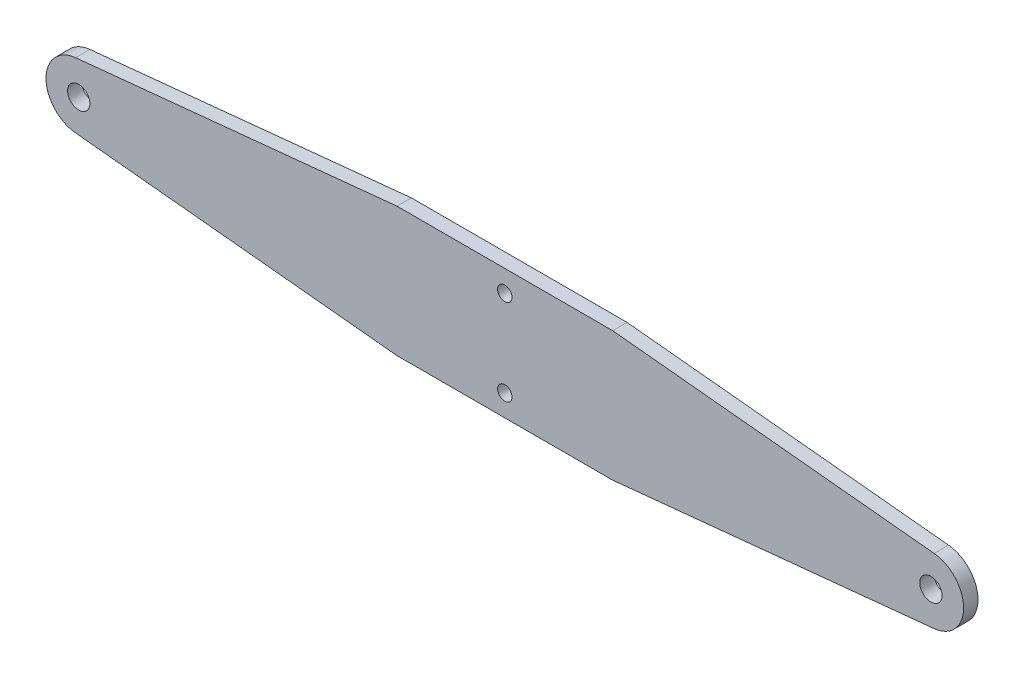
ISO-10303-21;
HEADER;
FILE_DESCRIPTION(('STEP AP214'),'2;1');
FILE_NAME('part.step','',(''),(''),'','','');
FILE_SCHEMA(('AUTOMOTIVE_DESIGN { 1 0 10303 214 1 1 1 1 }'));
ENDSEC;
DATA;
#1=APPLICATION_CONTEXT('core data for automotive mechanical design processes');
#2=APPLICATION_PROTOCOL_DEFINITION('international standard','automotive_design',2000,#1);
#3=PRODUCT_CONTEXT('',#1,'mechanical');
#4=PRODUCT('Part','Part','',(#3));
#5=PRODUCT_RELATED_PRODUCT_CATEGORY('part','',(#4));
#6=PRODUCT_DEFINITION_FORMATION('','',#4);
#7=PRODUCT_DEFINITION_CONTEXT('part definition',#1,'design');
#8=PRODUCT_DEFINITION('design','',#6,#7);
#9=PRODUCT_DEFINITION_SHAPE('','',#8);
#10=(LENGTH_UNIT() NAMED_UNIT(*) SI_UNIT(.MILLI.,.METRE.));
#11=(NAMED_UNIT(*) PLANE_ANGLE_UNIT() SI_UNIT($,.RADIAN.));
#12=(NAMED_UNIT(*) SI_UNIT($,.STERADIAN.) SOLID_ANGLE_UNIT());
#13=UNCERTAINTY_MEASURE_WITH_UNIT(LENGTH_MEASURE(1.E-05),#10,'distance_accuracy_value','');
#14=(GEOMETRIC_REPRESENTATION_CONTEXT(3) GLOBAL_UNCERTAINTY_ASSIGNED_CONTEXT((#13)) GLOBAL_UNIT_ASSIGNED_CONTEXT((#10,
#11,#12)) REPRESENTATION_CONTEXT('',''));
#15=CARTESIAN_POINT('',(0.,0.,0.));
#16=DIRECTION('',(0.,0.,1.));
#17=DIRECTION('',(1.,0.,0.));
#18=AXIS2_PLACEMENT_3D('',#15,#16,#17);
#19=CARTESIAN_POINT('',(-59.25,-3.57680115802996E-13,-2.));
#20=DIRECTION('',(0.,0.,-1.));
#21=DIRECTION('',(1.,0.,0.));
#22=AXIS2_PLACEMENT_3D('',#19,#20,#21);
#23=PLANE('',#22);
#24=CARTESIAN_POINT('',(59.25,-3.57680115025062E-13,-2.));
#25=DIRECTION('',(0.,0.,1.));
#26=DIRECTION('',(1.,0.,0.));
#27=AXIS2_PLACEMENT_3D('',#24,#25,#26);
#28=CIRCLE('',#27,1.54999999999999);
#29=CARTESIAN_POINT('',(60.8,-3.57680115025062E-13,-2.));
#30=VERTEX_POINT('',#29);
#31=EDGE_CURVE('E333',#30,#30,#28,.T.);
#32=ORIENTED_EDGE('',*,*,#31,.T.);
#33=EDGE_LOOP('',(#32));
#34=FACE_BOUND('',#33,.T.);
#35=CARTESIAN_POINT('',(0.,-6.,-2.));
#36=DIRECTION('',(0.,0.,1.));
#37=DIRECTION('',(1.,0.,0.));
#38=AXIS2_PLACEMENT_3D('',#35,#36,#37);
#39=CIRCLE('',#38,0.999999999999999);
#40=CARTESIAN_POINT('',(0.999999999999999,-6.,-2.));
#41=VERTEX_POINT('',#40);
#42=EDGE_CURVE('E146',#41,#41,#39,.T.);
#43=ORIENTED_EDGE('',*,*,#42,.T.);
#44=EDGE_LOOP('',(#43));
#45=FACE_BOUND('',#44,.T.);
#46=CARTESIAN_POINT('',(-59.25,-3.57680115802996E-13,-2.));
#47=DIRECTION('',(0.,0.,1.));
#48=DIRECTION('',(1.,0.,0.));
#49=AXIS2_PLACEMENT_3D('',#46,#47,#48);
#50=CIRCLE('',#49,4.55000000000007);
#51=CARTESIAN_POINT('',(-59.7029732140596,4.52739608023655,-2.));
#52=VERTEX_POINT('',#51);
#53=CARTESIAN_POINT('',(-59.7029732140607,-4.5273960802373,-2.));
#54=VERTEX_POINT('',#53);
#55=EDGE_CURVE('E163',#52,#54,#50,.T.);
#56=ORIENTED_EDGE('',*,*,#55,.F.);
#57=DIRECTION('',(-0.995032105546575,-0.0995545525405534,0.));
#58=VECTOR('',#57,1.);
#59=CARTESIAN_POINT('',(-59.7029732140596,4.52739608023655,-2.));
#60=LINE('',#59,#58);
#61=CARTESIAN_POINT('',(-15.,8.99999999999997,-2.));
#62=VERTEX_POINT('',#61);
#63=EDGE_CURVE('E137',#62,#52,#60,.T.);
#64=ORIENTED_EDGE('',*,*,#63,.F.);
#65=DIRECTION('',(-1.,0.,0.));
#66=VECTOR('',#65,1.);
#67=CARTESIAN_POINT('',(15.,8.99999999999997,-2.));
#68=LINE('',#67,#66);
#69=CARTESIAN_POINT('',(15.,8.99999999999997,-2.));
#70=VERTEX_POINT('',#69);
#71=EDGE_CURVE('E118',#70,#62,#68,.T.);
#72=ORIENTED_EDGE('',*,*,#71,.F.);
#73=DIRECTION('',(-0.995032105546575,0.0995545525405534,0.));
#74=VECTOR('',#73,1.);
#75=CARTESIAN_POINT('',(59.7029732140597,4.52739608023655,-2.));
#76=LINE('',#75,#74);
#77=CARTESIAN_POINT('',(59.7029732140597,4.52739608023655,-2.));
#78=VERTEX_POINT('',#77);
#79=EDGE_CURVE('E128',#78,#70,#76,.T.);
#80=ORIENTED_EDGE('',*,*,#79,.F.);
#81=CARTESIAN_POINT('',(59.25,-3.57680115025062E-13,-2.));
#82=DIRECTION('',(0.,0.,1.));
#83=DIRECTION('',(1.,0.,0.));
#84=AXIS2_PLACEMENT_3D('',#81,#82,#83);
#85=CIRCLE('',#84,4.55000000000001);
#86=CARTESIAN_POINT('',(59.7029732140593,-4.5273960802373,-2.));
#87=VERTEX_POINT('',#86);
#88=EDGE_CURVE('E133',#87,#78,#85,.T.);
#89=ORIENTED_EDGE('',*,*,#88,.F.);
#90=DIRECTION('',(0.995032105546576,0.0995545525405459,0.));
#91=VECTOR('',#90,1.);
#92=CARTESIAN_POINT('',(59.7029732140593,-4.5273960802373,-2.));
#93=LINE('',#92,#91);
#94=CARTESIAN_POINT('',(15.,-9.00000000000034,-2.));
#95=VERTEX_POINT('',#94);
#96=EDGE_CURVE('E189',#95,#87,#93,.T.);
#97=ORIENTED_EDGE('',*,*,#96,.F.);
#98=DIRECTION('',(1.,0.,0.));
#99=VECTOR('',#98,1.);
#100=CARTESIAN_POINT('',(15.,-9.00000000000034,-2.));
#101=LINE('',#100,#99);
#102=CARTESIAN_POINT('',(-15.,-9.00000000000034,-2.));
#103=VERTEX_POINT('',#102);
#104=EDGE_CURVE('E182',#103,#95,#101,.T.);
#105=ORIENTED_EDGE('',*,*,#104,.F.);
#106=DIRECTION('',(0.995032105546576,-0.0995545525405429,0.));
#107=VECTOR('',#106,1.);
#108=CARTESIAN_POINT('',(-59.7029732140607,-4.5273960802373,-2.));
#109=LINE('',#108,#107);
#110=EDGE_CURVE('E172',#54,#103,#109,.T.);
#111=ORIENTED_EDGE('',*,*,#110,.F.);
#112=EDGE_LOOP('',(#56,#64,#72,#80,#89,#97,#105,#111));
#113=FACE_BOUND('',#112,.T.);
#114=CARTESIAN_POINT('',(-59.25,-3.57680115802996E-13,-2.));
#115=DIRECTION('',(0.,0.,1.));
#116=DIRECTION('',(1.,0.,0.));
#117=AXIS2_PLACEMENT_3D('',#114,#115,#116);
#118=CIRCLE('',#117,1.55);
#119=CARTESIAN_POINT('',(-57.7,-3.57680115802996E-13,-2.));
#120=VERTEX_POINT('',#119);
#121=EDGE_CURVE('E338',#120,#120,#118,.T.);
#122=ORIENTED_EDGE('',*,*,#121,.T.);
#123=EDGE_LOOP('',(#122));
#124=FACE_BOUND('',#123,.T.);
#125=CARTESIAN_POINT('',(0.,6.,-2.));
#126=DIRECTION('',(0.,0.,1.));
#127=DIRECTION('',(-1.,0.,0.));
#128=AXIS2_PLACEMENT_3D('',#125,#126,#127);
#129=CIRCLE('',#128,1.);
#130=CARTESIAN_POINT('',(-1.,6.,-2.));
#131=VERTEX_POINT('',#130);
#132=EDGE_CURVE('E324',#131,#131,#129,.T.);
#133=ORIENTED_EDGE('',*,*,#132,.T.);
#134=EDGE_LOOP('',(#133));
#135=FACE_BOUND('',#134,.T.);
#136=ADVANCED_FACE('F45',(#34,#45,#113,#124,#135),#23,.T.);
#137=CARTESIAN_POINT('',(-59.25,-3.57680115802996E-13,0.));
#138=DIRECTION('',(0.,0.,-1.));
#139=DIRECTION('',(1.,0.,0.));
#140=AXIS2_PLACEMENT_3D('',#137,#138,#139);
#141=PLANE('',#140);
#142=CARTESIAN_POINT('',(-59.25,-3.57680115802996E-13,0.));
#143=DIRECTION('',(0.,0.,1.));
#144=DIRECTION('',(1.,0.,0.));
#145=AXIS2_PLACEMENT_3D('',#142,#143,#144);
#146=CIRCLE('',#145,4.55000000000007);
#147=CARTESIAN_POINT('',(-59.7029732140596,4.52739608023655,0.));
#148=VERTEX_POINT('',#147);
#149=CARTESIAN_POINT('',(-59.7029732140607,-4.5273960802373,0.));
#150=VERTEX_POINT('',#149);
#151=EDGE_CURVE('E142',#148,#150,#146,.T.);
#152=ORIENTED_EDGE('',*,*,#151,.T.);
#153=DIRECTION('',(0.995032105546576,-0.0995545525405429,0.));
#154=VECTOR('',#153,1.);
#155=CARTESIAN_POINT('',(-59.7029732140607,-4.5273960802373,0.));
#156=LINE('',#155,#154);
#157=CARTESIAN_POINT('',(-15.,-9.00000000000034,0.));
#158=VERTEX_POINT('',#157);
#159=EDGE_CURVE('E145',#150,#158,#156,.T.);
#160=ORIENTED_EDGE('',*,*,#159,.T.);
#161=DIRECTION('',(1.,0.,0.));
#162=VECTOR('',#161,1.);
#163=CARTESIAN_POINT('',(15.,-9.00000000000034,0.));
#164=LINE('',#163,#162);
#165=CARTESIAN_POINT('',(15.,-9.00000000000034,0.));
#166=VERTEX_POINT('',#165);
#167=EDGE_CURVE('E149',#158,#166,#164,.T.);
#168=ORIENTED_EDGE('',*,*,#167,.T.);
#169=DIRECTION('',(0.995032105546576,0.0995545525405459,0.));
#170=VECTOR('',#169,1.);
#171=CARTESIAN_POINT('',(59.7029732140593,-4.5273960802373,0.));
#172=LINE('',#171,#170);
#173=CARTESIAN_POINT('',(59.7029732140593,-4.5273960802373,0.));
#174=VERTEX_POINT('',#173);
#175=EDGE_CURVE('E152',#166,#174,#172,.T.);
#176=ORIENTED_EDGE('',*,*,#175,.T.);
#177=CARTESIAN_POINT('',(59.25,-3.57680115025062E-13,0.));
#178=DIRECTION('',(0.,0.,1.));
#179=DIRECTION('',(1.,0.,0.));
#180=AXIS2_PLACEMENT_3D('',#177,#178,#179);
#181=CIRCLE('',#180,4.55000000000001);
#182=CARTESIAN_POINT('',(59.7029732140597,4.52739608023655,0.));
#183=VERTEX_POINT('',#182);
#184=EDGE_CURVE('E155',#174,#183,#181,.T.);
#185=ORIENTED_EDGE('',*,*,#184,.T.);
#186=DIRECTION('',(-0.995032105546575,0.0995545525405534,0.));
#187=VECTOR('',#186,1.);
#188=CARTESIAN_POINT('',(59.7029732140597,4.52739608023655,0.));
#189=LINE('',#188,#187);
#190=CARTESIAN_POINT('',(15.,8.99999999999997,0.));
#191=VERTEX_POINT('',#190);
#192=EDGE_CURVE('E158',#183,#191,#189,.T.);
#193=ORIENTED_EDGE('',*,*,#192,.T.);
#194=DIRECTION('',(-1.,0.,0.));
#195=VECTOR('',#194,1.);
#196=CARTESIAN_POINT('',(15.,8.99999999999997,0.));
#197=LINE('',#196,#195);
#198=CARTESIAN_POINT('',(-15.,8.99999999999997,0.));
#199=VERTEX_POINT('',#198);
#200=EDGE_CURVE('E121',#191,#199,#197,.T.);
#201=ORIENTED_EDGE('',*,*,#200,.T.);
#202=DIRECTION('',(-0.995032105546575,-0.0995545525405534,0.));
#203=VECTOR('',#202,1.);
#204=CARTESIAN_POINT('',(-59.7029732140596,4.52739608023655,0.));
#205=LINE('',#204,#203);
#206=EDGE_CURVE('E161',#199,#148,#205,.T.);
#207=ORIENTED_EDGE('',*,*,#206,.T.);
#208=EDGE_LOOP('',(#152,#160,#168,#176,#185,#193,#201,#207));
#209=FACE_BOUND('',#208,.T.);
#210=CARTESIAN_POINT('',(0.,-6.,0.));
#211=DIRECTION('',(0.,0.,1.));
#212=DIRECTION('',(1.,0.,0.));
#213=AXIS2_PLACEMENT_3D('',#210,#211,#212);
#214=CIRCLE('',#213,0.999999999999999);
#215=CARTESIAN_POINT('',(0.999999999999999,-6.,0.));
#216=VERTEX_POINT('',#215);
#217=EDGE_CURVE('E185',#216,#216,#214,.T.);
#218=ORIENTED_EDGE('',*,*,#217,.F.);
#219=EDGE_LOOP('',(#218));
#220=FACE_BOUND('',#219,.T.);
#221=CARTESIAN_POINT('',(-59.25,-3.57680115802996E-13,0.));
#222=DIRECTION('',(0.,0.,1.));
#223=DIRECTION('',(1.,0.,0.));
#224=AXIS2_PLACEMENT_3D('',#221,#222,#223);
#225=CIRCLE('',#224,1.55);
#226=CARTESIAN_POINT('',(-57.7,-3.57680115802996E-13,0.));
#227=VERTEX_POINT('',#226);
#228=EDGE_CURVE('E335',#227,#227,#225,.T.);
#229=ORIENTED_EDGE('',*,*,#228,.F.);
#230=EDGE_LOOP('',(#229));
#231=FACE_BOUND('',#230,.T.);
#232=CARTESIAN_POINT('',(59.25,-3.57680115025062E-13,0.));
#233=DIRECTION('',(0.,0.,1.));
#234=DIRECTION('',(1.,0.,0.));
#235=AXIS2_PLACEMENT_3D('',#232,#233,#234);
#236=CIRCLE('',#235,1.54999999999999);
#237=CARTESIAN_POINT('',(60.8,-3.57680115025062E-13,0.));
#238=VERTEX_POINT('',#237);
#239=EDGE_CURVE('E330',#238,#238,#236,.T.);
#240=ORIENTED_EDGE('',*,*,#239,.F.);
#241=EDGE_LOOP('',(#240));
#242=FACE_BOUND('',#241,.T.);
#243=CARTESIAN_POINT('',(0.,6.,0.));
#244=DIRECTION('',(0.,0.,1.));
#245=DIRECTION('',(-1.,0.,0.));
#246=AXIS2_PLACEMENT_3D('',#243,#244,#245);
#247=CIRCLE('',#246,1.);
#248=CARTESIAN_POINT('',(-1.,6.,0.));
#249=VERTEX_POINT('',#248);
#250=EDGE_CURVE('E327',#249,#249,#247,.T.);
#251=ORIENTED_EDGE('',*,*,#250,.F.);
#252=EDGE_LOOP('',(#251));
#253=FACE_BOUND('',#252,.T.);
#254=ADVANCED_FACE('F179',(#209,#220,#231,#242,#253),#141,.F.);
#255=CARTESIAN_POINT('',(-59.25,-3.57680115802996E-13,-2.));
#256=DIRECTION('',(0.,0.,1.));
#257=DIRECTION('',(-1.,0.,0.));
#258=AXIS2_PLACEMENT_3D('',#255,#256,#257);
#259=CYLINDRICAL_SURFACE('',#258,4.55000000000007);
#260=ORIENTED_EDGE('',*,*,#151,.F.);
#261=DIRECTION('',(0.,0.,1.));
#262=VECTOR('',#261,1.);
#263=CARTESIAN_POINT('',(-59.7029732140596,4.52739608023655,-2.));
#264=LINE('',#263,#262);
#265=EDGE_CURVE('E62',#52,#148,#264,.T.);
#266=ORIENTED_EDGE('',*,*,#265,.F.);
#267=ORIENTED_EDGE('',*,*,#55,.T.);
#268=DIRECTION('',(0.,0.,1.));
#269=VECTOR('',#268,1.);
#270=CARTESIAN_POINT('',(-59.7029732140607,-4.5273960802373,-2.));
#271=LINE('',#270,#269);
#272=EDGE_CURVE('E11',#54,#150,#271,.T.);
#273=ORIENTED_EDGE('',*,*,#272,.T.);
#274=EDGE_LOOP('',(#260,#266,#267,#273));
#275=FACE_BOUND('',#274,.T.);
#276=ADVANCED_FACE('F47',(#275),#259,.T.);
#277=CARTESIAN_POINT('',(-59.7029732140607,-4.5273960802373,-2.));
#278=DIRECTION('',(0.0995545525405429,0.995032105546576,0.));
#279=DIRECTION('',(-0.995032105546576,0.0995545525405429,0.));
#280=AXIS2_PLACEMENT_3D('',#277,#278,#279);
#281=PLANE('',#280);
#282=ORIENTED_EDGE('',*,*,#159,.F.);
#283=ORIENTED_EDGE('',*,*,#272,.F.);
#284=ORIENTED_EDGE('',*,*,#110,.T.);
#285=DIRECTION('',(0.,0.,1.));
#286=VECTOR('',#285,1.);
#287=CARTESIAN_POINT('',(-15.,-9.00000000000034,-2.));
#288=LINE('',#287,#286);
#289=EDGE_CURVE('E54',#103,#158,#288,.T.);
#290=ORIENTED_EDGE('',*,*,#289,.T.);
#291=EDGE_LOOP('',(#282,#283,#284,#290));
#292=FACE_BOUND('',#291,.T.);
#293=ADVANCED_FACE('F171',(#292),#281,.F.);
#294=CARTESIAN_POINT('',(15.,-9.00000000000034,-2.));
#295=DIRECTION('',(0.,1.,0.));
#296=DIRECTION('',(0.,0.,-1.));
#297=AXIS2_PLACEMENT_3D('',#294,#295,#296);
#298=PLANE('',#297);
#299=ORIENTED_EDGE('',*,*,#167,.F.);
#300=ORIENTED_EDGE('',*,*,#289,.F.);
#301=ORIENTED_EDGE('',*,*,#104,.T.);
#302=DIRECTION('',(0.,0.,1.));
#303=VECTOR('',#302,1.);
#304=CARTESIAN_POINT('',(15.,-9.00000000000034,-2.));
#305=LINE('',#304,#303);
#306=EDGE_CURVE('E169',#95,#166,#305,.T.);
#307=ORIENTED_EDGE('',*,*,#306,.T.);
#308=EDGE_LOOP('',(#299,#300,#301,#307));
#309=FACE_BOUND('',#308,.T.);
#310=ADVANCED_FACE('F176',(#309),#298,.F.);
#311=CARTESIAN_POINT('',(59.7029732140593,-4.5273960802373,-2.));
#312=DIRECTION('',(-0.0995545525405459,0.995032105546576,0.));
#313=DIRECTION('',(-0.995032105546576,-0.0995545525405459,0.));
#314=AXIS2_PLACEMENT_3D('',#311,#312,#313);
#315=PLANE('',#314);
#316=ORIENTED_EDGE('',*,*,#175,.F.);
#317=ORIENTED_EDGE('',*,*,#306,.F.);
#318=ORIENTED_EDGE('',*,*,#96,.T.);
#319=DIRECTION('',(0.,0.,1.));
#320=VECTOR('',#319,1.);
#321=CARTESIAN_POINT('',(59.7029732140593,-4.5273960802373,-2.));
#322=LINE('',#321,#320);
#323=EDGE_CURVE('E167',#87,#174,#322,.T.);
#324=ORIENTED_EDGE('',*,*,#323,.T.);
#325=EDGE_LOOP('',(#316,#317,#318,#324));
#326=FACE_BOUND('',#325,.T.);
#327=ADVANCED_FACE('F196',(#326),#315,.F.);
#328=CARTESIAN_POINT('',(59.25,-3.57680115025062E-13,-2.));
#329=DIRECTION('',(0.,0.,1.));
#330=DIRECTION('',(-1.,0.,0.));
#331=AXIS2_PLACEMENT_3D('',#328,#329,#330);
#332=CYLINDRICAL_SURFACE('',#331,4.55000000000001);
#333=ORIENTED_EDGE('',*,*,#184,.F.);
#334=ORIENTED_EDGE('',*,*,#323,.F.);
#335=ORIENTED_EDGE('',*,*,#88,.T.);
#336=DIRECTION('',(0.,0.,1.));
#337=VECTOR('',#336,1.);
#338=CARTESIAN_POINT('',(59.7029732140597,4.52739608023655,-2.));
#339=LINE('',#338,#337);
#340=EDGE_CURVE('E125',#78,#183,#339,.T.);
#341=ORIENTED_EDGE('',*,*,#340,.T.);
#342=EDGE_LOOP('',(#333,#334,#335,#341));
#343=FACE_BOUND('',#342,.T.);
#344=ADVANCED_FACE('F193',(#343),#332,.T.);
#345=CARTESIAN_POINT('',(59.7029732140597,4.52739608023655,-2.));
#346=DIRECTION('',(-0.0995545525405534,-0.995032105546575,0.));
#347=DIRECTION('',(0.995032105546575,-0.0995545525405535,0.));
#348=AXIS2_PLACEMENT_3D('',#345,#346,#347);
#349=PLANE('',#348);
#350=ORIENTED_EDGE('',*,*,#192,.F.);
#351=ORIENTED_EDGE('',*,*,#340,.F.);
#352=ORIENTED_EDGE('',*,*,#79,.T.);
#353=DIRECTION('',(0.,0.,1.));
#354=VECTOR('',#353,1.);
#355=CARTESIAN_POINT('',(15.,8.99999999999997,-2.));
#356=LINE('',#355,#354);
#357=EDGE_CURVE('E114',#70,#191,#356,.T.);
#358=ORIENTED_EDGE('',*,*,#357,.T.);
#359=EDGE_LOOP('',(#350,#351,#352,#358));
#360=FACE_BOUND('',#359,.T.);
#361=ADVANCED_FACE('F129',(#360),#349,.F.);
#362=CARTESIAN_POINT('',(15.,8.99999999999997,-2.));
#363=DIRECTION('',(0.,-1.,0.));
#364=DIRECTION('',(0.,0.,1.));
#365=AXIS2_PLACEMENT_3D('',#362,#363,#364);
#366=PLANE('',#365);
#367=ORIENTED_EDGE('',*,*,#200,.F.);
#368=ORIENTED_EDGE('',*,*,#357,.F.);
#369=ORIENTED_EDGE('',*,*,#71,.T.);
#370=DIRECTION('',(0.,0.,1.));
#371=VECTOR('',#370,1.);
#372=CARTESIAN_POINT('',(-15.,8.99999999999997,-2.));
#373=LINE('',#372,#371);
#374=EDGE_CURVE('E90',#62,#199,#373,.T.);
#375=ORIENTED_EDGE('',*,*,#374,.T.);
#376=EDGE_LOOP('',(#367,#368,#369,#375));
#377=FACE_BOUND('',#376,.T.);
#378=ADVANCED_FACE('F116',(#377),#366,.F.);
#379=CARTESIAN_POINT('',(-59.7029732140596,4.52739608023655,-2.));
#380=DIRECTION('',(0.0995545525405534,-0.995032105546575,0.));
#381=DIRECTION('',(0.995032105546575,0.0995545525405534,0.));
#382=AXIS2_PLACEMENT_3D('',#379,#380,#381);
#383=PLANE('',#382);
#384=ORIENTED_EDGE('',*,*,#206,.F.);
#385=ORIENTED_EDGE('',*,*,#374,.F.);
#386=ORIENTED_EDGE('',*,*,#63,.T.);
#387=ORIENTED_EDGE('',*,*,#265,.T.);
#388=EDGE_LOOP('',(#384,#385,#386,#387));
#389=FACE_BOUND('',#388,.T.);
#390=ADVANCED_FACE('F218',(#389),#383,.F.);
#391=CARTESIAN_POINT('',(0.,-6.,-2.));
#392=DIRECTION('',(0.,0.,1.));
#393=DIRECTION('',(-1.,0.,0.));
#394=AXIS2_PLACEMENT_3D('',#391,#392,#393);
#395=CYLINDRICAL_SURFACE('',#394,0.999999999999999);
#396=ORIENTED_EDGE('',*,*,#42,.F.);
#397=EDGE_LOOP('',(#396));
#398=FACE_BOUND('',#397,.T.);
#399=ORIENTED_EDGE('',*,*,#217,.T.);
#400=EDGE_LOOP('',(#399));
#401=FACE_BOUND('',#400,.T.);
#402=ADVANCED_FACE('F215',(#398,#401),#395,.F.);
#403=CARTESIAN_POINT('',(-59.25,-3.57680115802996E-13,-2.));
#404=DIRECTION('',(0.,0.,1.));
#405=DIRECTION('',(-1.,0.,0.));
#406=AXIS2_PLACEMENT_3D('',#403,#404,#405);
#407=CYLINDRICAL_SURFACE('',#406,1.55);
#408=ORIENTED_EDGE('',*,*,#121,.F.);
#409=EDGE_LOOP('',(#408));
#410=FACE_BOUND('',#409,.T.);
#411=ORIENTED_EDGE('',*,*,#228,.T.);
#412=EDGE_LOOP('',(#411));
#413=FACE_BOUND('',#412,.T.);
#414=ADVANCED_FACE('F245',(#410,#413),#407,.F.);
#415=CARTESIAN_POINT('',(59.25,-3.57680115025062E-13,-2.));
#416=DIRECTION('',(0.,0.,1.));
#417=DIRECTION('',(-1.,0.,0.));
#418=AXIS2_PLACEMENT_3D('',#415,#416,#417);
#419=CYLINDRICAL_SURFACE('',#418,1.54999999999999);
#420=ORIENTED_EDGE('',*,*,#31,.F.);
#421=EDGE_LOOP('',(#420));
#422=FACE_BOUND('',#421,.T.);
#423=ORIENTED_EDGE('',*,*,#239,.T.);
#424=EDGE_LOOP('',(#423));
#425=FACE_BOUND('',#424,.T.);
#426=ADVANCED_FACE('F253',(#422,#425),#419,.F.);
#427=CARTESIAN_POINT('',(0.,6.,-2.));
#428=DIRECTION('',(0.,0.,1.));
#429=DIRECTION('',(-1.,0.,0.));
#430=AXIS2_PLACEMENT_3D('',#427,#428,#429);
#431=CYLINDRICAL_SURFACE('',#430,1.);
#432=ORIENTED_EDGE('',*,*,#132,.F.);
#433=EDGE_LOOP('',(#432));
#434=FACE_BOUND('',#433,.T.);
#435=ORIENTED_EDGE('',*,*,#250,.T.);
#436=EDGE_LOOP('',(#435));
#437=FACE_BOUND('',#436,.T.);
#438=ADVANCED_FACE('F261',(#434,#437),#431,.F.);
#439=CLOSED_SHELL('',(#136,#254,#276,#293,#310,#327,#344,#361,#378,#390,#402,#414,#426,#438));
#440=MANIFOLD_SOLID_BREP('B2',#439);
#441=ADVANCED_BREP_SHAPE_REPRESENTATION('',(#18,#440),#14);
#442=SHAPE_DEFINITION_REPRESENTATION(#9,#441);
ENDSEC;
END-ISO-10303-21;
